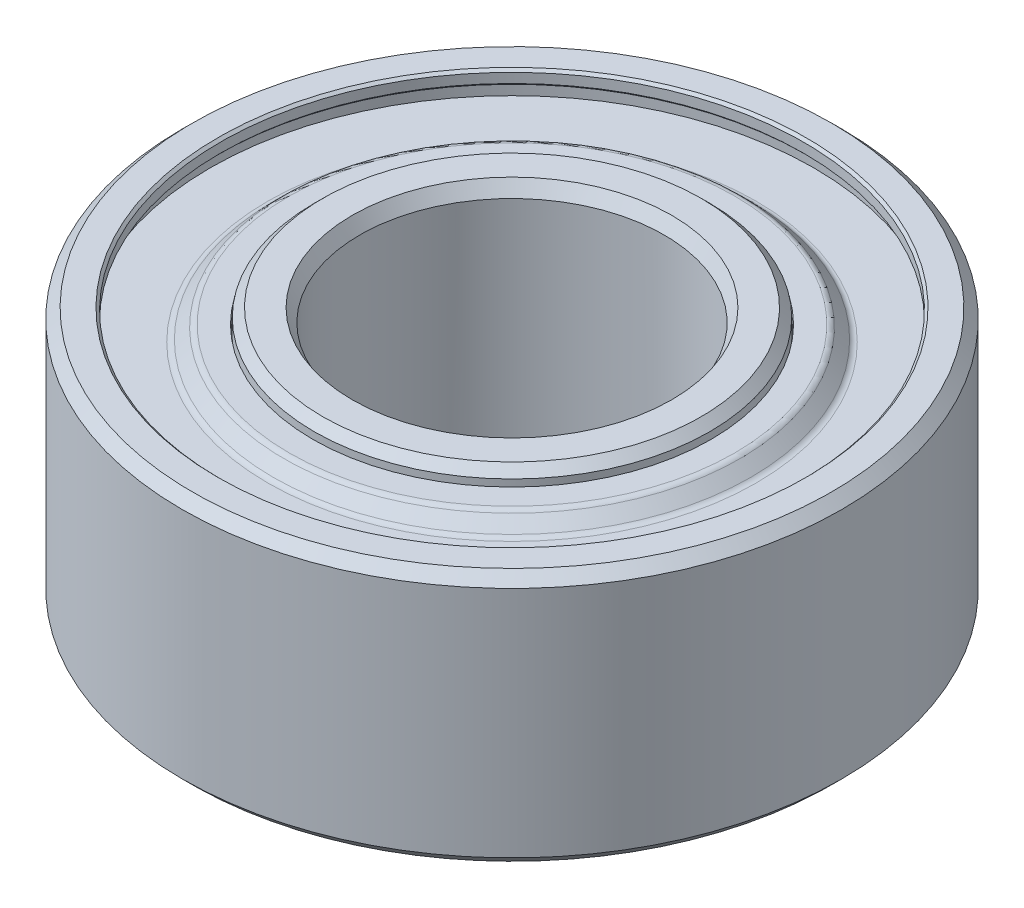
ISO-10303-21;
HEADER;
FILE_DESCRIPTION(('STEP AP214'),'2;1');
FILE_NAME('part.step','',(''),(''),'','','');
FILE_SCHEMA(('AUTOMOTIVE_DESIGN { 1 0 10303 214 1 1 1 1 }'));
ENDSEC;
DATA;
#1=APPLICATION_CONTEXT('core data for automotive mechanical design processes');
#2=APPLICATION_PROTOCOL_DEFINITION('international standard','automotive_design',2000,#1);
#3=PRODUCT_CONTEXT('',#1,'mechanical');
#4=PRODUCT('Part','Part','',(#3));
#5=PRODUCT_RELATED_PRODUCT_CATEGORY('part','',(#4));
#6=PRODUCT_DEFINITION_FORMATION('','',#4);
#7=PRODUCT_DEFINITION_CONTEXT('part definition',#1,'design');
#8=PRODUCT_DEFINITION('design','',#6,#7);
#9=PRODUCT_DEFINITION_SHAPE('','',#8);
#10=(LENGTH_UNIT() NAMED_UNIT(*) SI_UNIT(.MILLI.,.METRE.));
#11=(NAMED_UNIT(*) PLANE_ANGLE_UNIT() SI_UNIT($,.RADIAN.));
#12=(NAMED_UNIT(*) SI_UNIT($,.STERADIAN.) SOLID_ANGLE_UNIT());
#13=UNCERTAINTY_MEASURE_WITH_UNIT(LENGTH_MEASURE(1.E-05),#10,'distance_accuracy_value','');
#14=(GEOMETRIC_REPRESENTATION_CONTEXT(3) GLOBAL_UNCERTAINTY_ASSIGNED_CONTEXT((#13)) GLOBAL_UNIT_ASSIGNED_CONTEXT((#10,
#11,#12)) REPRESENTATION_CONTEXT('',''));
#15=CARTESIAN_POINT('',(0.,0.,0.));
#16=DIRECTION('',(0.,0.,1.));
#17=DIRECTION('',(1.,0.,0.));
#18=AXIS2_PLACEMENT_3D('',#15,#16,#17);
#19=CARTESIAN_POINT('',(0.,0.,0.));
#20=DIRECTION('',(0.,1.,0.));
#21=DIRECTION('',(0.,0.,1.));
#22=AXIS2_PLACEMENT_3D('',#19,#20,#21);
#23=CYLINDRICAL_SURFACE('',#22,3.);
#24=CARTESIAN_POINT('',(0.,4.74019237884704,0.));
#25=DIRECTION('',(0.,1.,0.));
#26=DIRECTION('',(0.,0.,1.));
#27=AXIS2_PLACEMENT_3D('',#24,#25,#26);
#28=CIRCLE('',#27,3.00000000004275);
#29=CARTESIAN_POINT('',(0.,4.74019237884704,3.00000000004275));
#30=VERTEX_POINT('',#29);
#31=EDGE_CURVE('E421',#30,#30,#28,.T.);
#32=ORIENTED_EDGE('',*,*,#31,.T.);
#33=EDGE_LOOP('',(#32));
#34=FACE_BOUND('',#33,.T.);
#35=CARTESIAN_POINT('',(0.,0.259807621148411,0.));
#36=DIRECTION('',(0.,-1.,0.));
#37=DIRECTION('',(0.,0.,-1.));
#38=AXIS2_PLACEMENT_3D('',#35,#36,#37);
#39=CIRCLE('',#38,2.9999999999859);
#40=CARTESIAN_POINT('',(0.,0.259807621148411,-2.9999999999859));
#41=VERTEX_POINT('',#40);
#42=EDGE_CURVE('E418',#41,#41,#39,.T.);
#43=ORIENTED_EDGE('',*,*,#42,.T.);
#44=EDGE_LOOP('',(#43));
#45=FACE_BOUND('',#44,.T.);
#46=ADVANCED_FACE('F17',(#34,#45),#23,.F.);
#47=CARTESIAN_POINT('',(0.,4.99999999993861,0.));
#48=DIRECTION('',(0.,1.,0.));
#49=DIRECTION('',(0.,0.,1.));
#50=AXIS2_PLACEMENT_3D('',#47,#48,#49);
#51=CONICAL_SURFACE('',#50,3.15000000000509,0.523598775562543);
#52=ORIENTED_EDGE('',*,*,#31,.F.);
#53=EDGE_LOOP('',(#52));
#54=FACE_BOUND('',#53,.T.);
#55=CARTESIAN_POINT('',(0.,4.99999999993861,0.));
#56=DIRECTION('',(0.,1.,0.));
#57=DIRECTION('',(0.,0.,1.));
#58=AXIS2_PLACEMENT_3D('',#55,#56,#57);
#59=CIRCLE('',#58,3.15000000000509);
#60=CARTESIAN_POINT('',(0.,4.99999999993861,3.15000000000509));
#61=VERTEX_POINT('',#60);
#62=EDGE_CURVE('E416',#61,#61,#59,.F.);
#63=ORIENTED_EDGE('',*,*,#62,.F.);
#64=EDGE_LOOP('',(#63));
#65=FACE_BOUND('',#64,.T.);
#66=ADVANCED_FACE('F186',(#54,#65),#51,.F.);
#67=CARTESIAN_POINT('',(0.,1.70530256582424E-10,0.));
#68=DIRECTION('',(0.,-1.,0.));
#69=DIRECTION('',(0.,0.,-1.));
#70=AXIS2_PLACEMENT_3D('',#67,#68,#69);
#71=CONICAL_SURFACE('',#70,3.14999999989141,0.523598775631897);
#72=CARTESIAN_POINT('',(0.,-5.6843418860808E-11,0.));
#73=DIRECTION('',(0.,-1.,0.));
#74=DIRECTION('',(0.,0.,-1.));
#75=AXIS2_PLACEMENT_3D('',#72,#73,#74);
#76=CIRCLE('',#75,3.15000000002268);
#77=CARTESIAN_POINT('',(0.,-5.6843418860808E-11,-3.15000000002268));
#78=VERTEX_POINT('',#77);
#79=EDGE_CURVE('E414',#78,#78,#76,.T.);
#80=ORIENTED_EDGE('',*,*,#79,.T.);
#81=EDGE_LOOP('',(#80));
#82=FACE_BOUND('',#81,.T.);
#83=ORIENTED_EDGE('',*,*,#42,.F.);
#84=EDGE_LOOP('',(#83));
#85=FACE_BOUND('',#84,.T.);
#86=ADVANCED_FACE('F183',(#82,#85),#71,.F.);
#87=CARTESIAN_POINT('',(0.,5.,0.));
#88=DIRECTION('',(0.,1.,0.));
#89=DIRECTION('',(0.,0.,1.));
#90=AXIS2_PLACEMENT_3D('',#87,#88,#89);
#91=PLANE('',#90);
#92=ORIENTED_EDGE('',*,*,#62,.T.);
#93=EDGE_LOOP('',(#92));
#94=FACE_BOUND('',#93,.T.);
#95=CARTESIAN_POINT('',(0.,4.99999999999545,0.));
#96=DIRECTION('',(0.,-1.,0.));
#97=DIRECTION('',(0.,0.,-1.));
#98=AXIS2_PLACEMENT_3D('',#95,#96,#97);
#99=CIRCLE('',#98,3.73000000001866);
#100=CARTESIAN_POINT('',(0.,4.99999999999545,-3.73000000001866));
#101=VERTEX_POINT('',#100);
#102=EDGE_CURVE('E411',#101,#101,#99,.T.);
#103=ORIENTED_EDGE('',*,*,#102,.F.);
#104=EDGE_LOOP('',(#103));
#105=FACE_BOUND('',#104,.T.);
#106=ADVANCED_FACE('F179',(#94,#105),#91,.T.);
#107=CARTESIAN_POINT('',(0.,0.,0.));
#108=DIRECTION('',(0.,1.,0.));
#109=DIRECTION('',(0.,0.,1.));
#110=AXIS2_PLACEMENT_3D('',#107,#108,#109);
#111=PLANE('',#110);
#112=ORIENTED_EDGE('',*,*,#79,.F.);
#113=EDGE_LOOP('',(#112));
#114=FACE_BOUND('',#113,.T.);
#115=CARTESIAN_POINT('',(0.,5.6843418860808E-11,0.));
#116=DIRECTION('',(0.,1.,0.));
#117=DIRECTION('',(0.,0.,1.));
#118=AXIS2_PLACEMENT_3D('',#115,#116,#117);
#119=CIRCLE('',#118,3.73000000001866);
#120=CARTESIAN_POINT('',(0.,5.6843418860808E-11,3.73000000001866));
#121=VERTEX_POINT('',#120);
#122=EDGE_CURVE('E407',#121,#121,#119,.T.);
#123=ORIENTED_EDGE('',*,*,#122,.F.);
#124=EDGE_LOOP('',(#123));
#125=FACE_BOUND('',#124,.T.);
#126=ADVANCED_FACE('F175',(#114,#125),#111,.F.);
#127=CARTESIAN_POINT('',(0.,4.83000000002676,0.));
#128=DIRECTION('',(0.,-1.,0.));
#129=DIRECTION('',(0.,0.,-1.));
#130=AXIS2_PLACEMENT_3D('',#127,#128,#129);
#131=CONICAL_SURFACE('',#130,3.9000000000442,0.785398163564635);
#132=CARTESIAN_POINT('',(0.,4.83,0.));
#133=DIRECTION('',(0.,1.,0.));
#134=DIRECTION('',(0.,0.,1.));
#135=AXIS2_PLACEMENT_3D('',#132,#133,#134);
#136=CIRCLE('',#135,3.9);
#137=CARTESIAN_POINT('',(0.,4.83,3.9));
#138=VERTEX_POINT('',#137);
#139=EDGE_CURVE('E410',#138,#138,#136,.F.);
#140=ORIENTED_EDGE('',*,*,#139,.F.);
#141=EDGE_LOOP('',(#140));
#142=FACE_BOUND('',#141,.T.);
#143=ORIENTED_EDGE('',*,*,#102,.T.);
#144=EDGE_LOOP('',(#143));
#145=FACE_BOUND('',#144,.T.);
#146=ADVANCED_FACE('F171',(#142,#145),#131,.T.);
#147=CARTESIAN_POINT('',(0.,0.170000000025539,0.));
#148=DIRECTION('',(0.,1.,0.));
#149=DIRECTION('',(0.,0.,1.));
#150=AXIS2_PLACEMENT_3D('',#147,#148,#149);
#151=CONICAL_SURFACE('',#150,3.89999999998736,0.785398163397448);
#152=ORIENTED_EDGE('',*,*,#122,.T.);
#153=EDGE_LOOP('',(#152));
#154=FACE_BOUND('',#153,.T.);
#155=CARTESIAN_POINT('',(0.,0.170000000000004,0.));
#156=DIRECTION('',(0.,-1.,0.));
#157=DIRECTION('',(0.,0.,-1.));
#158=AXIS2_PLACEMENT_3D('',#155,#156,#157);
#159=CIRCLE('',#158,3.9);
#160=CARTESIAN_POINT('',(0.,0.170000000000004,-3.9));
#161=VERTEX_POINT('',#160);
#162=EDGE_CURVE('E79',#161,#161,#159,.F.);
#163=ORIENTED_EDGE('',*,*,#162,.F.);
#164=EDGE_LOOP('',(#163));
#165=FACE_BOUND('',#164,.T.);
#166=ADVANCED_FACE('F167',(#154,#165),#151,.T.);
#167=CARTESIAN_POINT('',(0.,4.71,0.));
#168=DIRECTION('',(0.,1.,0.));
#169=DIRECTION('',(0.,0.,1.));
#170=AXIS2_PLACEMENT_3D('',#167,#168,#169);
#171=CYLINDRICAL_SURFACE('',#170,3.9);
#172=ORIENTED_EDGE('',*,*,#139,.T.);
#173=EDGE_LOOP('',(#172));
#174=FACE_BOUND('',#173,.T.);
#175=CARTESIAN_POINT('',(0.,4.456,0.));
#176=DIRECTION('',(0.,1.,0.));
#177=DIRECTION('',(0.,0.,1.));
#178=AXIS2_PLACEMENT_3D('',#175,#176,#177);
#179=CIRCLE('',#178,3.9);
#180=CARTESIAN_POINT('',(0.,4.456,3.9));
#181=VERTEX_POINT('',#180);
#182=EDGE_CURVE('E404',#181,#181,#179,.F.);
#183=ORIENTED_EDGE('',*,*,#182,.F.);
#184=EDGE_LOOP('',(#183));
#185=FACE_BOUND('',#184,.T.);
#186=ADVANCED_FACE('F163',(#174,#185),#171,.T.);
#187=CARTESIAN_POINT('',(0.,0.3,0.));
#188=DIRECTION('',(0.,-1.,0.));
#189=DIRECTION('',(0.,0.,-1.));
#190=AXIS2_PLACEMENT_3D('',#187,#188,#189);
#191=CYLINDRICAL_SURFACE('',#190,3.9);
#192=CARTESIAN_POINT('',(0.,0.544,0.));
#193=DIRECTION('',(0.,-1.,0.));
#194=DIRECTION('',(0.,0.,-1.));
#195=AXIS2_PLACEMENT_3D('',#192,#193,#194);
#196=CIRCLE('',#195,3.9);
#197=CARTESIAN_POINT('',(0.,0.544,-3.9));
#198=VERTEX_POINT('',#197);
#199=EDGE_CURVE('E401',#198,#198,#196,.F.);
#200=ORIENTED_EDGE('',*,*,#199,.F.);
#201=EDGE_LOOP('',(#200));
#202=FACE_BOUND('',#201,.T.);
#203=ORIENTED_EDGE('',*,*,#162,.T.);
#204=EDGE_LOOP('',(#203));
#205=FACE_BOUND('',#204,.T.);
#206=ADVANCED_FACE('F159',(#202,#205),#191,.T.);
#207=CARTESIAN_POINT('',(0.,4.456,0.));
#208=DIRECTION('',(0.,1.,0.));
#209=DIRECTION('',(0.,0.,1.));
#210=AXIS2_PLACEMENT_3D('',#207,#208,#209);
#211=PLANE('',#210);
#212=CARTESIAN_POINT('',(0.,4.456,0.));
#213=DIRECTION('',(0.,1.,0.));
#214=DIRECTION('',(0.,0.,1.));
#215=AXIS2_PLACEMENT_3D('',#212,#213,#214);
#216=CIRCLE('',#215,3.925);
#217=CARTESIAN_POINT('',(0.,4.456,3.925));
#218=VERTEX_POINT('',#217);
#219=EDGE_CURVE('E398',#218,#218,#216,.T.);
#220=ORIENTED_EDGE('',*,*,#219,.T.);
#221=EDGE_LOOP('',(#220));
#222=FACE_BOUND('',#221,.T.);
#223=ORIENTED_EDGE('',*,*,#182,.T.);
#224=EDGE_LOOP('',(#223));
#225=FACE_BOUND('',#224,.T.);
#226=ADVANCED_FACE('F155',(#222,#225),#211,.T.);
#227=CARTESIAN_POINT('',(0.,0.544,0.));
#228=DIRECTION('',(0.,-1.,0.));
#229=DIRECTION('',(0.,0.,-1.));
#230=AXIS2_PLACEMENT_3D('',#227,#228,#229);
#231=PLANE('',#230);
#232=CARTESIAN_POINT('',(0.,0.544,0.));
#233=DIRECTION('',(0.,-1.,0.));
#234=DIRECTION('',(0.,0.,-1.));
#235=AXIS2_PLACEMENT_3D('',#232,#233,#234);
#236=CIRCLE('',#235,3.925);
#237=CARTESIAN_POINT('',(0.,0.544,-3.925));
#238=VERTEX_POINT('',#237);
#239=EDGE_CURVE('E395',#238,#238,#236,.T.);
#240=ORIENTED_EDGE('',*,*,#239,.T.);
#241=EDGE_LOOP('',(#240));
#242=FACE_BOUND('',#241,.T.);
#243=ORIENTED_EDGE('',*,*,#199,.T.);
#244=EDGE_LOOP('',(#243));
#245=FACE_BOUND('',#244,.T.);
#246=ADVANCED_FACE('F151',(#242,#245),#231,.T.);
#247=CARTESIAN_POINT('',(0.,4.456,0.));
#248=DIRECTION('',(0.,1.,0.));
#249=DIRECTION('',(0.,0.,1.));
#250=AXIS2_PLACEMENT_3D('',#247,#248,#249);
#251=CYLINDRICAL_SURFACE('',#250,3.925);
#252=CARTESIAN_POINT('',(0.,4.71,0.));
#253=DIRECTION('',(0.,1.,0.));
#254=DIRECTION('',(0.,0.,1.));
#255=AXIS2_PLACEMENT_3D('',#252,#253,#254);
#256=CIRCLE('',#255,3.925);
#257=CARTESIAN_POINT('',(0.,4.71,3.925));
#258=VERTEX_POINT('',#257);
#259=EDGE_CURVE('E392',#258,#258,#256,.F.);
#260=ORIENTED_EDGE('',*,*,#259,.F.);
#261=EDGE_LOOP('',(#260));
#262=FACE_BOUND('',#261,.T.);
#263=ORIENTED_EDGE('',*,*,#219,.F.);
#264=EDGE_LOOP('',(#263));
#265=FACE_BOUND('',#264,.T.);
#266=ADVANCED_FACE('F147',(#262,#265),#251,.F.);
#267=CARTESIAN_POINT('',(0.,0.544,0.));
#268=DIRECTION('',(0.,-1.,0.));
#269=DIRECTION('',(0.,0.,-1.));
#270=AXIS2_PLACEMENT_3D('',#267,#268,#269);
#271=CYLINDRICAL_SURFACE('',#270,3.925);
#272=ORIENTED_EDGE('',*,*,#239,.F.);
#273=EDGE_LOOP('',(#272));
#274=FACE_BOUND('',#273,.T.);
#275=CARTESIAN_POINT('',(0.,0.3,0.));
#276=DIRECTION('',(0.,-1.,0.));
#277=DIRECTION('',(0.,0.,-1.));
#278=AXIS2_PLACEMENT_3D('',#275,#276,#277);
#279=CIRCLE('',#278,3.925);
#280=CARTESIAN_POINT('',(0.,0.3,-3.925));
#281=VERTEX_POINT('',#280);
#282=EDGE_CURVE('E65',#281,#281,#279,.F.);
#283=ORIENTED_EDGE('',*,*,#282,.F.);
#284=EDGE_LOOP('',(#283));
#285=FACE_BOUND('',#284,.T.);
#286=ADVANCED_FACE('F143',(#274,#285),#271,.F.);
#287=CARTESIAN_POINT('',(0.,4.71,0.));
#288=DIRECTION('',(0.,1.,0.));
#289=DIRECTION('',(0.,0.,1.));
#290=AXIS2_PLACEMENT_3D('',#287,#288,#289);
#291=PLANE('',#290);
#292=CARTESIAN_POINT('',(0.,4.71,0.));
#293=DIRECTION('',(0.,-1.,0.));
#294=DIRECTION('',(0.,0.,-1.));
#295=AXIS2_PLACEMENT_3D('',#292,#293,#294);
#296=CIRCLE('',#295,4.38909727492467);
#297=CARTESIAN_POINT('',(0.,4.71,-4.38909727492467));
#298=VERTEX_POINT('',#297);
#299=CARTESIAN_POINT('',(0.,4.71,4.38909727492467));
#300=VERTEX_POINT('',#299);
#301=EDGE_CURVE('E63',#298,#300,#296,.T.);
#302=ORIENTED_EDGE('',*,*,#301,.F.);
#303=CARTESIAN_POINT('',(0.,4.71,0.));
#304=DIRECTION('',(0.,-1.,0.));
#305=DIRECTION('',(0.,0.,1.));
#306=AXIS2_PLACEMENT_3D('',#303,#304,#305);
#307=CIRCLE('',#306,4.38909727492467);
#308=EDGE_CURVE('E57',#300,#298,#307,.T.);
#309=ORIENTED_EDGE('',*,*,#308,.F.);
#310=EDGE_LOOP('',(#302,#309));
#311=FACE_BOUND('',#310,.T.);
#312=ORIENTED_EDGE('',*,*,#259,.T.);
#313=EDGE_LOOP('',(#312));
#314=FACE_BOUND('',#313,.T.);
#315=ADVANCED_FACE('F61',(#311,#314),#291,.T.);
#316=CARTESIAN_POINT('',(0.,0.3,0.));
#317=DIRECTION('',(0.,-1.,0.));
#318=DIRECTION('',(0.,0.,-1.));
#319=AXIS2_PLACEMENT_3D('',#316,#317,#318);
#320=PLANE('',#319);
#321=ORIENTED_EDGE('',*,*,#282,.T.);
#322=EDGE_LOOP('',(#321));
#323=FACE_BOUND('',#322,.T.);
#324=CARTESIAN_POINT('',(0.,0.3,0.));
#325=DIRECTION('',(0.,1.,0.));
#326=DIRECTION('',(0.,0.,1.));
#327=AXIS2_PLACEMENT_3D('',#324,#325,#326);
#328=CIRCLE('',#327,4.38909727492467);
#329=CARTESIAN_POINT('',(0.,0.3,4.38909727492467));
#330=VERTEX_POINT('',#329);
#331=CARTESIAN_POINT('',(0.,0.3,-4.38909727492467));
#332=VERTEX_POINT('',#331);
#333=EDGE_CURVE('E106',#330,#332,#328,.T.);
#334=ORIENTED_EDGE('',*,*,#333,.F.);
#335=CARTESIAN_POINT('',(0.,0.3,0.));
#336=DIRECTION('',(0.,1.,0.));
#337=DIRECTION('',(0.,0.,-1.));
#338=AXIS2_PLACEMENT_3D('',#335,#336,#337);
#339=CIRCLE('',#338,4.38909727492467);
#340=EDGE_CURVE('E71',#332,#330,#339,.T.);
#341=ORIENTED_EDGE('',*,*,#340,.F.);
#342=EDGE_LOOP('',(#334,#341));
#343=FACE_BOUND('',#342,.T.);
#344=ADVANCED_FACE('F92',(#323,#343),#320,.T.);
#345=CARTESIAN_POINT('',(0.,4.56,0.));
#346=DIRECTION('',(0.,1.,0.));
#347=DIRECTION('',(0.,0.,1.));
#348=AXIS2_PLACEMENT_3D('',#345,#346,#347);
#349=TOROIDAL_SURFACE('',#348,4.38909727492467,0.15);
#350=ORIENTED_EDGE('',*,*,#308,.T.);
#351=ORIENTED_EDGE('',*,*,#301,.T.);
#352=EDGE_LOOP('',(#350,#351));
#353=FACE_BOUND('',#352,.T.);
#354=CARTESIAN_POINT('',(0.,4.66606601719377,0.));
#355=DIRECTION('',(0.,-1.,0.));
#356=DIRECTION('',(0.,0.,-1.));
#357=AXIS2_PLACEMENT_3D('',#354,#355,#356);
#358=CIRCLE('',#357,4.4951632920629);
#359=CARTESIAN_POINT('',(0.,4.66606601719377,-4.4951632920629));
#360=VERTEX_POINT('',#359);
#361=EDGE_CURVE('E101',#360,#360,#358,.T.);
#362=ORIENTED_EDGE('',*,*,#361,.F.);
#363=EDGE_LOOP('',(#362));
#364=FACE_BOUND('',#363,.T.);
#365=ADVANCED_FACE('F69',(#353,#364),#349,.T.);
#366=CARTESIAN_POINT('',(0.,0.45,0.));
#367=DIRECTION('',(0.,-1.,0.));
#368=DIRECTION('',(0.,0.,-1.));
#369=AXIS2_PLACEMENT_3D('',#366,#367,#368);
#370=TOROIDAL_SURFACE('',#369,4.38909727492467,0.15);
#371=ORIENTED_EDGE('',*,*,#340,.T.);
#372=ORIENTED_EDGE('',*,*,#333,.T.);
#373=EDGE_LOOP('',(#371,#372));
#374=FACE_BOUND('',#373,.T.);
#375=CARTESIAN_POINT('',(0.,0.343933982833278,0.));
#376=DIRECTION('',(0.,1.,0.));
#377=DIRECTION('',(0.,0.,1.));
#378=AXIS2_PLACEMENT_3D('',#375,#376,#377);
#379=CIRCLE('',#378,4.49516329211974);
#380=CARTESIAN_POINT('',(0.,0.343933982833278,4.49516329211974));
#381=VERTEX_POINT('',#380);
#382=EDGE_CURVE('E353',#381,#381,#379,.T.);
#383=ORIENTED_EDGE('',*,*,#382,.F.);
#384=EDGE_LOOP('',(#383));
#385=FACE_BOUND('',#384,.T.);
#386=ADVANCED_FACE('F91',(#374,#385),#370,.T.);
#387=CARTESIAN_POINT('',(0.,4.45393398280203,0.));
#388=DIRECTION('',(0.,-1.,0.));
#389=DIRECTION('',(0.,0.,-1.));
#390=AXIS2_PLACEMENT_3D('',#387,#388,#389);
#391=CONICAL_SURFACE('',#390,4.7072953263978,0.785398163263467);
#392=CARTESIAN_POINT('',(0.,4.45393398282202,0.));
#393=DIRECTION('',(0.,1.,0.));
#394=DIRECTION('',(0.,0.,1.));
#395=AXIS2_PLACEMENT_3D('',#392,#393,#394);
#396=CIRCLE('',#395,4.70729532645862);
#397=CARTESIAN_POINT('',(0.,4.45393398282202,4.70729532645862));
#398=VERTEX_POINT('',#397);
#399=EDGE_CURVE('E357',#398,#398,#396,.T.);
#400=ORIENTED_EDGE('',*,*,#399,.T.);
#401=EDGE_LOOP('',(#400));
#402=FACE_BOUND('',#401,.T.);
#403=ORIENTED_EDGE('',*,*,#361,.T.);
#404=EDGE_LOOP('',(#403));
#405=FACE_BOUND('',#404,.T.);
#406=ADVANCED_FACE('F531',(#402,#405),#391,.T.);
#407=CARTESIAN_POINT('',(0.,0.546066017136582,0.));
#408=DIRECTION('',(0.,1.,0.));
#409=DIRECTION('',(0.,0.,1.));
#410=AXIS2_PLACEMENT_3D('',#407,#408,#409);
#411=CONICAL_SURFACE('',#410,4.69729532642305,0.785398163397448);
#412=CARTESIAN_POINT('',(0.,0.546066017177981,0.));
#413=DIRECTION('',(0.,-1.,0.));
#414=DIRECTION('',(0.,0.,-1.));
#415=AXIS2_PLACEMENT_3D('',#412,#413,#414);
#416=CIRCLE('',#415,4.69729532645861);
#417=CARTESIAN_POINT('',(0.,0.546066017177981,-4.69729532645861));
#418=VERTEX_POINT('',#417);
#419=EDGE_CURVE('E362',#418,#418,#416,.T.);
#420=ORIENTED_EDGE('',*,*,#419,.T.);
#421=EDGE_LOOP('',(#420));
#422=FACE_BOUND('',#421,.T.);
#423=ORIENTED_EDGE('',*,*,#382,.T.);
#424=EDGE_LOOP('',(#423));
#425=FACE_BOUND('',#424,.T.);
#426=ADVANCED_FACE('F537',(#422,#425),#411,.T.);
#427=CARTESIAN_POINT('',(0.,4.56,0.));
#428=DIRECTION('',(0.,1.,0.));
#429=DIRECTION('',(0.,0.,1.));
#430=AXIS2_PLACEMENT_3D('',#427,#428,#429);
#431=TOROIDAL_SURFACE('',#430,4.8133613436366,0.15);
#432=ORIENTED_EDGE('',*,*,#399,.F.);
#433=EDGE_LOOP('',(#432));
#434=FACE_BOUND('',#433,.T.);
#435=CARTESIAN_POINT('',(0.,4.41,0.));
#436=DIRECTION('',(0.,1.,0.));
#437=DIRECTION('',(0.,0.,-1.));
#438=AXIS2_PLACEMENT_3D('',#435,#436,#437);
#439=CIRCLE('',#438,4.8133613436366);
#440=CARTESIAN_POINT('',(0.,4.41,4.8133613436366));
#441=VERTEX_POINT('',#440);
#442=CARTESIAN_POINT('',(0.,4.41,-4.8133613436366));
#443=VERTEX_POINT('',#442);
#444=EDGE_CURVE('E289',#441,#443,#439,.F.);
#445=ORIENTED_EDGE('',*,*,#444,.F.);
#446=CARTESIAN_POINT('',(0.,4.41,0.));
#447=DIRECTION('',(0.,1.,0.));
#448=DIRECTION('',(0.,0.,1.));
#449=AXIS2_PLACEMENT_3D('',#446,#447,#448);
#450=CIRCLE('',#449,4.8133613436366);
#451=EDGE_CURVE('E299',#443,#441,#450,.F.);
#452=ORIENTED_EDGE('',*,*,#451,.F.);
#453=EDGE_LOOP('',(#445,#452));
#454=FACE_BOUND('',#453,.T.);
#455=ADVANCED_FACE('F314',(#434,#454),#431,.F.);
#456=CARTESIAN_POINT('',(0.,0.44,0.));
#457=DIRECTION('',(0.,-1.,0.));
#458=DIRECTION('',(0.,0.,-1.));
#459=AXIS2_PLACEMENT_3D('',#456,#457,#458);
#460=TOROIDAL_SURFACE('',#459,4.80336134363659,0.15);
#461=ORIENTED_EDGE('',*,*,#419,.F.);
#462=EDGE_LOOP('',(#461));
#463=FACE_BOUND('',#462,.T.);
#464=CARTESIAN_POINT('',(0.,0.59,0.));
#465=DIRECTION('',(0.,-1.,0.));
#466=DIRECTION('',(0.,0.,1.));
#467=AXIS2_PLACEMENT_3D('',#464,#465,#466);
#468=CIRCLE('',#467,4.80336134363659);
#469=CARTESIAN_POINT('',(0.,0.59,-4.80336134363659));
#470=VERTEX_POINT('',#469);
#471=CARTESIAN_POINT('',(0.,0.59,4.80336134363659));
#472=VERTEX_POINT('',#471);
#473=EDGE_CURVE('E377',#470,#472,#468,.F.);
#474=ORIENTED_EDGE('',*,*,#473,.F.);
#475=CARTESIAN_POINT('',(0.,0.59,0.));
#476=DIRECTION('',(0.,-1.,0.));
#477=DIRECTION('',(0.,0.,-1.));
#478=AXIS2_PLACEMENT_3D('',#475,#476,#477);
#479=CIRCLE('',#478,4.80336134363659);
#480=EDGE_CURVE('E36',#472,#470,#479,.F.);
#481=ORIENTED_EDGE('',*,*,#480,.F.);
#482=EDGE_LOOP('',(#474,#481));
#483=FACE_BOUND('',#482,.T.);
#484=ADVANCED_FACE('F310',(#463,#483),#460,.F.);
#485=CARTESIAN_POINT('',(0.,4.41,0.));
#486=DIRECTION('',(0.,1.,0.));
#487=DIRECTION('',(0.,0.,1.));
#488=AXIS2_PLACEMENT_3D('',#485,#486,#487);
#489=PLANE('',#488);
#490=CARTESIAN_POINT('',(0.,4.41,0.));
#491=DIRECTION('',(0.,1.,0.));
#492=DIRECTION('',(0.,0.,1.));
#493=AXIS2_PLACEMENT_3D('',#490,#491,#492);
#494=CIRCLE('',#493,5.95);
#495=CARTESIAN_POINT('',(0.,4.41,5.95));
#496=VERTEX_POINT('',#495);
#497=EDGE_CURVE('E379',#496,#496,#494,.T.);
#498=ORIENTED_EDGE('',*,*,#497,.T.);
#499=EDGE_LOOP('',(#498));
#500=FACE_BOUND('',#499,.T.);
#501=ORIENTED_EDGE('',*,*,#444,.T.);
#502=ORIENTED_EDGE('',*,*,#451,.T.);
#503=EDGE_LOOP('',(#501,#502));
#504=FACE_BOUND('',#503,.T.);
#505=ADVANCED_FACE('F266',(#500,#504),#489,.T.);
#506=CARTESIAN_POINT('',(0.,0.59,0.));
#507=DIRECTION('',(0.,-1.,0.));
#508=DIRECTION('',(0.,0.,-1.));
#509=AXIS2_PLACEMENT_3D('',#506,#507,#508);
#510=PLANE('',#509);
#511=CARTESIAN_POINT('',(0.,0.59,0.));
#512=DIRECTION('',(0.,-1.,0.));
#513=DIRECTION('',(0.,0.,-1.));
#514=AXIS2_PLACEMENT_3D('',#511,#512,#513);
#515=CIRCLE('',#514,5.95);
#516=CARTESIAN_POINT('',(0.,0.59,-5.95));
#517=VERTEX_POINT('',#516);
#518=EDGE_CURVE('E381',#517,#517,#515,.T.);
#519=ORIENTED_EDGE('',*,*,#518,.T.);
#520=EDGE_LOOP('',(#519));
#521=FACE_BOUND('',#520,.T.);
#522=ORIENTED_EDGE('',*,*,#473,.T.);
#523=ORIENTED_EDGE('',*,*,#480,.T.);
#524=EDGE_LOOP('',(#522,#523));
#525=FACE_BOUND('',#524,.T.);
#526=ADVANCED_FACE('F261',(#521,#525),#510,.T.);
#527=CARTESIAN_POINT('',(0.,4.41,0.));
#528=DIRECTION('',(0.,1.,0.));
#529=DIRECTION('',(0.,0.,1.));
#530=AXIS2_PLACEMENT_3D('',#527,#528,#529);
#531=CYLINDRICAL_SURFACE('',#530,5.95);
#532=ORIENTED_EDGE('',*,*,#497,.F.);
#533=EDGE_LOOP('',(#532));
#534=FACE_BOUND('',#533,.T.);
#535=CARTESIAN_POINT('',(0.,4.71,0.));
#536=DIRECTION('',(0.,1.,0.));
#537=DIRECTION('',(0.,0.,1.));
#538=AXIS2_PLACEMENT_3D('',#535,#536,#537);
#539=CIRCLE('',#538,5.95);
#540=CARTESIAN_POINT('',(0.,4.71,5.95));
#541=VERTEX_POINT('',#540);
#542=EDGE_CURVE('E386',#541,#541,#539,.T.);
#543=ORIENTED_EDGE('',*,*,#542,.T.);
#544=EDGE_LOOP('',(#543));
#545=FACE_BOUND('',#544,.T.);
#546=ADVANCED_FACE('F257',(#534,#545),#531,.F.);
#547=CARTESIAN_POINT('',(0.,0.59,0.));
#548=DIRECTION('',(0.,-1.,0.));
#549=DIRECTION('',(0.,0.,-1.));
#550=AXIS2_PLACEMENT_3D('',#547,#548,#549);
#551=CYLINDRICAL_SURFACE('',#550,5.95);
#552=CARTESIAN_POINT('',(0.,0.29,0.));
#553=DIRECTION('',(0.,-1.,0.));
#554=DIRECTION('',(0.,0.,-1.));
#555=AXIS2_PLACEMENT_3D('',#552,#553,#554);
#556=CIRCLE('',#555,5.95);
#557=CARTESIAN_POINT('',(0.,0.29,-5.95));
#558=VERTEX_POINT('',#557);
#559=EDGE_CURVE('E448',#558,#558,#556,.T.);
#560=ORIENTED_EDGE('',*,*,#559,.T.);
#561=EDGE_LOOP('',(#560));
#562=FACE_BOUND('',#561,.T.);
#563=ORIENTED_EDGE('',*,*,#518,.F.);
#564=EDGE_LOOP('',(#563));
#565=FACE_BOUND('',#564,.T.);
#566=ADVANCED_FACE('F253',(#562,#565),#551,.F.);
#567=CARTESIAN_POINT('',(0.,4.71,0.));
#568=DIRECTION('',(0.,1.,0.));
#569=DIRECTION('',(0.,0.,1.));
#570=AXIS2_PLACEMENT_3D('',#567,#568,#569);
#571=PLANE('',#570);
#572=ORIENTED_EDGE('',*,*,#542,.F.);
#573=EDGE_LOOP('',(#572));
#574=FACE_BOUND('',#573,.T.);
#575=CARTESIAN_POINT('',(0.,4.70999999998867,0.));
#576=DIRECTION('',(0.,-1.,0.));
#577=DIRECTION('',(0.,0.,-1.));
#578=AXIS2_PLACEMENT_3D('',#575,#576,#577);
#579=CIRCLE('',#578,5.79999999996517);
#580=CARTESIAN_POINT('',(0.,4.70999999998867,-5.79999999996517));
#581=VERTEX_POINT('',#580);
#582=EDGE_CURVE('E445',#581,#581,#579,.F.);
#583=ORIENTED_EDGE('',*,*,#582,.T.);
#584=EDGE_LOOP('',(#583));
#585=FACE_BOUND('',#584,.T.);
#586=ADVANCED_FACE('F249',(#574,#585),#571,.F.);
#587=CARTESIAN_POINT('',(0.,0.29,0.));
#588=DIRECTION('',(0.,-1.,0.));
#589=DIRECTION('',(0.,0.,-1.));
#590=AXIS2_PLACEMENT_3D('',#587,#588,#589);
#591=PLANE('',#590);
#592=ORIENTED_EDGE('',*,*,#559,.F.);
#593=EDGE_LOOP('',(#592));
#594=FACE_BOUND('',#593,.T.);
#595=CARTESIAN_POINT('',(0.,0.290000000006785,0.));
#596=DIRECTION('',(0.,1.,0.));
#597=DIRECTION('',(0.,0.,1.));
#598=AXIS2_PLACEMENT_3D('',#595,#596,#597);
#599=CIRCLE('',#598,5.80000000002201);
#600=CARTESIAN_POINT('',(0.,0.290000000006785,5.80000000002201));
#601=VERTEX_POINT('',#600);
#602=EDGE_CURVE('E441',#601,#601,#599,.F.);
#603=ORIENTED_EDGE('',*,*,#602,.T.);
#604=EDGE_LOOP('',(#603));
#605=FACE_BOUND('',#604,.T.);
#606=ADVANCED_FACE('F245',(#594,#605),#591,.F.);
#607=CARTESIAN_POINT('',(0.,4.71000000004551,0.));
#608=DIRECTION('',(0.,-1.,0.));
#609=DIRECTION('',(0.,0.,-1.));
#610=AXIS2_PLACEMENT_3D('',#607,#608,#609);
#611=CONICAL_SURFACE('',#610,5.79999999990832,0.785398163397448);
#612=CARTESIAN_POINT('',(0.,4.76000000000001,0.));
#613=DIRECTION('',(0.,1.,0.));
#614=DIRECTION('',(0.,0.,1.));
#615=AXIS2_PLACEMENT_3D('',#612,#613,#614);
#616=CIRCLE('',#615,5.75);
#617=CARTESIAN_POINT('',(0.,4.76000000000001,5.75));
#618=VERTEX_POINT('',#617);
#619=EDGE_CURVE('E444',#618,#618,#616,.T.);
#620=ORIENTED_EDGE('',*,*,#619,.T.);
#621=EDGE_LOOP('',(#620));
#622=FACE_BOUND('',#621,.T.);
#623=ORIENTED_EDGE('',*,*,#582,.F.);
#624=EDGE_LOOP('',(#623));
#625=FACE_BOUND('',#624,.T.);
#626=ADVANCED_FACE('F241',(#622,#625),#611,.F.);
#627=CARTESIAN_POINT('',(0.,0.289999999893098,0.));
#628=DIRECTION('',(0.,1.,0.));
#629=DIRECTION('',(0.,0.,1.));
#630=AXIS2_PLACEMENT_3D('',#627,#628,#629);
#631=CONICAL_SURFACE('',#630,5.79999999990832,0.785398163397448);
#632=ORIENTED_EDGE('',*,*,#602,.F.);
#633=EDGE_LOOP('',(#632));
#634=FACE_BOUND('',#633,.T.);
#635=CARTESIAN_POINT('',(0.,0.239999999999998,0.));
#636=DIRECTION('',(0.,-1.,0.));
#637=DIRECTION('',(0.,0.,-1.));
#638=AXIS2_PLACEMENT_3D('',#635,#636,#637);
#639=CIRCLE('',#638,5.75);
#640=CARTESIAN_POINT('',(0.,0.239999999999998,-5.75));
#641=VERTEX_POINT('',#640);
#642=EDGE_CURVE('E463',#641,#641,#639,.T.);
#643=ORIENTED_EDGE('',*,*,#642,.T.);
#644=EDGE_LOOP('',(#643));
#645=FACE_BOUND('',#644,.T.);
#646=ADVANCED_FACE('F237',(#634,#645),#631,.F.);
#647=CARTESIAN_POINT('',(0.,4.71,0.));
#648=DIRECTION('',(0.,1.,0.));
#649=DIRECTION('',(0.,0.,1.));
#650=AXIS2_PLACEMENT_3D('',#647,#648,#649);
#651=CYLINDRICAL_SURFACE('',#650,5.75);
#652=ORIENTED_EDGE('',*,*,#619,.F.);
#653=EDGE_LOOP('',(#652));
#654=FACE_BOUND('',#653,.T.);
#655=CARTESIAN_POINT('',(0.,4.950000000008,0.));
#656=DIRECTION('',(0.,1.,0.));
#657=DIRECTION('',(0.,0.,1.));
#658=AXIS2_PLACEMENT_3D('',#655,#656,#657);
#659=CIRCLE('',#658,5.74999999997772);
#660=CARTESIAN_POINT('',(0.,4.950000000008,5.74999999997772));
#661=VERTEX_POINT('',#660);
#662=EDGE_CURVE('E465',#661,#661,#659,.T.);
#663=ORIENTED_EDGE('',*,*,#662,.T.);
#664=EDGE_LOOP('',(#663));
#665=FACE_BOUND('',#664,.T.);
#666=ADVANCED_FACE('F233',(#654,#665),#651,.F.);
#667=CARTESIAN_POINT('',(0.,0.3,0.));
#668=DIRECTION('',(0.,-1.,0.));
#669=DIRECTION('',(0.,0.,-1.));
#670=AXIS2_PLACEMENT_3D('',#667,#668,#669);
#671=CYLINDRICAL_SURFACE('',#670,5.75);
#672=CARTESIAN_POINT('',(0.,0.049999999987449,0.));
#673=DIRECTION('',(0.,-1.,0.));
#674=DIRECTION('',(0.,0.,-1.));
#675=AXIS2_PLACEMENT_3D('',#672,#673,#674);
#676=CIRCLE('',#675,5.74999999997772);
#677=CARTESIAN_POINT('',(0.,0.049999999987449,-5.74999999997772));
#678=VERTEX_POINT('',#677);
#679=EDGE_CURVE('E440',#678,#678,#676,.T.);
#680=ORIENTED_EDGE('',*,*,#679,.T.);
#681=EDGE_LOOP('',(#680));
#682=FACE_BOUND('',#681,.T.);
#683=ORIENTED_EDGE('',*,*,#642,.F.);
#684=EDGE_LOOP('',(#683));
#685=FACE_BOUND('',#684,.T.);
#686=ADVANCED_FACE('F229',(#682,#685),#671,.F.);
#687=CARTESIAN_POINT('',(0.,4.99999999993861,0.));
#688=DIRECTION('',(0.,1.,0.));
#689=DIRECTION('',(0.,0.,1.));
#690=AXIS2_PLACEMENT_3D('',#687,#688,#689);
#691=CONICAL_SURFACE('',#690,5.79999999990832,0.785398163397448);
#692=ORIENTED_EDGE('',*,*,#662,.F.);
#693=EDGE_LOOP('',(#692));
#694=FACE_BOUND('',#693,.T.);
#695=CARTESIAN_POINT('',(0.,4.99999999999545,0.));
#696=DIRECTION('',(0.,1.,0.));
#697=DIRECTION('',(0.,0.,1.));
#698=AXIS2_PLACEMENT_3D('',#695,#696,#697);
#699=CIRCLE('',#698,5.79999999996517);
#700=CARTESIAN_POINT('',(0.,4.99999999999545,5.79999999996517));
#701=VERTEX_POINT('',#700);
#702=EDGE_CURVE('E437',#701,#701,#699,.F.);
#703=ORIENTED_EDGE('',*,*,#702,.F.);
#704=EDGE_LOOP('',(#703));
#705=FACE_BOUND('',#704,.T.);
#706=ADVANCED_FACE('F225',(#694,#705),#691,.F.);
#707=CARTESIAN_POINT('',(0.,-5.6843418860808E-11,0.));
#708=DIRECTION('',(0.,-1.,0.));
#709=DIRECTION('',(0.,0.,-1.));
#710=AXIS2_PLACEMENT_3D('',#707,#708,#709);
#711=CONICAL_SURFACE('',#710,5.80000000002201,0.785398163397448);
#712=CARTESIAN_POINT('',(0.,-5.6843418860808E-11,0.));
#713=DIRECTION('',(0.,-1.,0.));
#714=DIRECTION('',(0.,0.,-1.));
#715=AXIS2_PLACEMENT_3D('',#712,#713,#714);
#716=CIRCLE('',#715,5.80000000002201);
#717=CARTESIAN_POINT('',(0.,-5.6843418860808E-11,-5.80000000002201));
#718=VERTEX_POINT('',#717);
#719=EDGE_CURVE('E434',#718,#718,#716,.T.);
#720=ORIENTED_EDGE('',*,*,#719,.T.);
#721=EDGE_LOOP('',(#720));
#722=FACE_BOUND('',#721,.T.);
#723=ORIENTED_EDGE('',*,*,#679,.F.);
#724=EDGE_LOOP('',(#723));
#725=FACE_BOUND('',#724,.T.);
#726=ADVANCED_FACE('F221',(#722,#725),#711,.F.);
#727=CARTESIAN_POINT('',(0.,5.,0.));
#728=DIRECTION('',(0.,1.,0.));
#729=DIRECTION('',(0.,0.,1.));
#730=AXIS2_PLACEMENT_3D('',#727,#728,#729);
#731=PLANE('',#730);
#732=ORIENTED_EDGE('',*,*,#702,.T.);
#733=EDGE_LOOP('',(#732));
#734=FACE_BOUND('',#733,.T.);
#735=CARTESIAN_POINT('',(0.,4.99999999999545,0.));
#736=DIRECTION('',(0.,-1.,0.));
#737=DIRECTION('',(0.,0.,-1.));
#738=AXIS2_PLACEMENT_3D('',#735,#736,#737);
#739=CIRCLE('',#738,6.30000000001019);
#740=CARTESIAN_POINT('',(0.,4.99999999999545,-6.30000000001019));
#741=VERTEX_POINT('',#740);
#742=EDGE_CURVE('E431',#741,#741,#739,.T.);
#743=ORIENTED_EDGE('',*,*,#742,.F.);
#744=EDGE_LOOP('',(#743));
#745=FACE_BOUND('',#744,.T.);
#746=ADVANCED_FACE('F217',(#734,#745),#731,.T.);
#747=CARTESIAN_POINT('',(0.,0.,0.));
#748=DIRECTION('',(0.,1.,0.));
#749=DIRECTION('',(0.,0.,1.));
#750=AXIS2_PLACEMENT_3D('',#747,#748,#749);
#751=PLANE('',#750);
#752=CARTESIAN_POINT('',(0.,0.,0.));
#753=DIRECTION('',(0.,1.,0.));
#754=DIRECTION('',(-1.,0.,0.));
#755=AXIS2_PLACEMENT_3D('',#752,#753,#754);
#756=CIRCLE('',#755,6.30000000001019);
#757=CARTESIAN_POINT('',(-6.30000000001019,0.,0.));
#758=VERTEX_POINT('',#757);
#759=EDGE_CURVE('E428',#758,#758,#756,.T.);
#760=ORIENTED_EDGE('',*,*,#759,.F.);
#761=EDGE_LOOP('',(#760));
#762=FACE_BOUND('',#761,.T.);
#763=ORIENTED_EDGE('',*,*,#719,.F.);
#764=EDGE_LOOP('',(#763));
#765=FACE_BOUND('',#764,.T.);
#766=ADVANCED_FACE('F213',(#762,#765),#751,.F.);
#767=CARTESIAN_POINT('',(0.,4.80000000021619,0.));
#768=DIRECTION('',(0.,-1.,0.));
#769=DIRECTION('',(0.,0.,-1.));
#770=AXIS2_PLACEMENT_3D('',#767,#768,#769);
#771=CONICAL_SURFACE('',#770,6.49999999978945,0.785398163397448);
#772=ORIENTED_EDGE('',*,*,#742,.T.);
#773=EDGE_LOOP('',(#772));
#774=FACE_BOUND('',#773,.T.);
#775=CARTESIAN_POINT('',(0.,4.8,0.));
#776=DIRECTION('',(0.,-1.,0.));
#777=DIRECTION('',(0.,0.,-1.));
#778=AXIS2_PLACEMENT_3D('',#775,#776,#777);
#779=CIRCLE('',#778,6.5);
#780=CARTESIAN_POINT('',(0.,4.8,-6.5));
#781=VERTEX_POINT('',#780);
#782=EDGE_CURVE('E28',#781,#781,#779,.T.);
#783=ORIENTED_EDGE('',*,*,#782,.F.);
#784=EDGE_LOOP('',(#783));
#785=FACE_BOUND('',#784,.T.);
#786=ADVANCED_FACE('F205',(#774,#785),#771,.T.);
#787=CARTESIAN_POINT('',(0.,0.199999999779266,0.));
#788=DIRECTION('',(0.,1.,0.));
#789=DIRECTION('',(-1.,0.,0.));
#790=AXIS2_PLACEMENT_3D('',#787,#788,#789);
#791=CONICAL_SURFACE('',#790,6.49999999978945,0.785398163397448);
#792=CARTESIAN_POINT('',(0.,0.199999999999998,0.));
#793=DIRECTION('',(0.,-1.,0.));
#794=DIRECTION('',(0.,0.,-1.));
#795=AXIS2_PLACEMENT_3D('',#792,#793,#794);
#796=CIRCLE('',#795,6.5);
#797=CARTESIAN_POINT('',(0.,0.199999999999998,-6.5));
#798=VERTEX_POINT('',#797);
#799=EDGE_CURVE('E11',#798,#798,#796,.F.);
#800=ORIENTED_EDGE('',*,*,#799,.F.);
#801=EDGE_LOOP('',(#800));
#802=FACE_BOUND('',#801,.T.);
#803=ORIENTED_EDGE('',*,*,#759,.T.);
#804=EDGE_LOOP('',(#803));
#805=FACE_BOUND('',#804,.T.);
#806=ADVANCED_FACE('F199',(#802,#805),#791,.T.);
#807=CARTESIAN_POINT('',(0.,4.05,0.));
#808=DIRECTION('',(0.,-1.,0.));
#809=DIRECTION('',(0.,0.,-1.));
#810=AXIS2_PLACEMENT_3D('',#807,#808,#809);
#811=CYLINDRICAL_SURFACE('',#810,6.5);
#812=ORIENTED_EDGE('',*,*,#782,.T.);
#813=EDGE_LOOP('',(#812));
#814=FACE_BOUND('',#813,.T.);
#815=ORIENTED_EDGE('',*,*,#799,.T.);
#816=EDGE_LOOP('',(#815));
#817=FACE_BOUND('',#816,.T.);
#818=ADVANCED_FACE('F197',(#814,#817),#811,.T.);
#819=CLOSED_SHELL('',(#46,#66,#86,#106,#126,#146,#166,#186,#206,#226,#246,#266,#286,#315,#344,
#365,#386,#406,#426,#455,#484,#505,#526,#546,#566,#586,#606,#626,#646,#666,#686,#706,#726,#746,
#766,#786,#806,#818));
#820=MANIFOLD_SOLID_BREP('B1',#819);
#821=ADVANCED_BREP_SHAPE_REPRESENTATION('',(#18,#820),#14);
#822=SHAPE_DEFINITION_REPRESENTATION(#9,#821);
ENDSEC;
END-ISO-10303-21;
